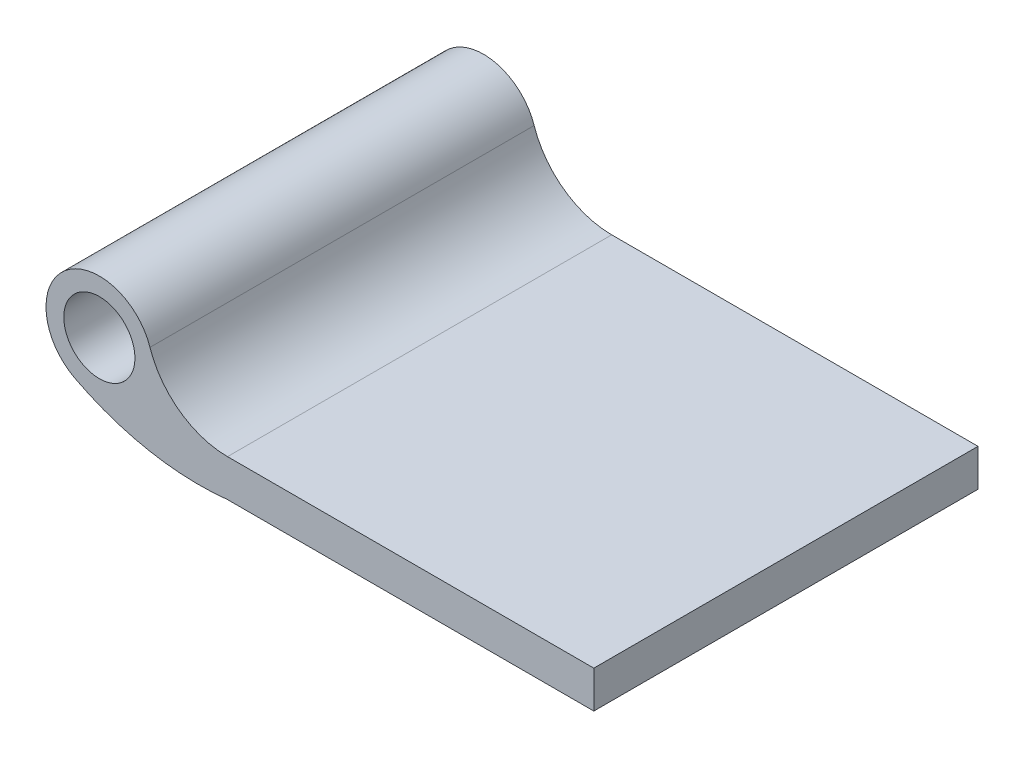
ISO-10303-21;
HEADER;
FILE_DESCRIPTION(('STEP AP214'),'2;1');
FILE_NAME('part.step','',(''),(''),'','','');
FILE_SCHEMA(('AUTOMOTIVE_DESIGN { 1 0 10303 214 1 1 1 1 }'));
ENDSEC;
DATA;
#1=APPLICATION_CONTEXT('core data for automotive mechanical design processes');
#2=APPLICATION_PROTOCOL_DEFINITION('international standard','automotive_design',2000,#1);
#3=PRODUCT_CONTEXT('',#1,'mechanical');
#4=PRODUCT('Part','Part','',(#3));
#5=PRODUCT_RELATED_PRODUCT_CATEGORY('part','',(#4));
#6=PRODUCT_DEFINITION_FORMATION('','',#4);
#7=PRODUCT_DEFINITION_CONTEXT('part definition',#1,'design');
#8=PRODUCT_DEFINITION('design','',#6,#7);
#9=PRODUCT_DEFINITION_SHAPE('','',#8);
#10=(LENGTH_UNIT() NAMED_UNIT(*) SI_UNIT(.MILLI.,.METRE.));
#11=(NAMED_UNIT(*) PLANE_ANGLE_UNIT() SI_UNIT($,.RADIAN.));
#12=(NAMED_UNIT(*) SI_UNIT($,.STERADIAN.) SOLID_ANGLE_UNIT());
#13=UNCERTAINTY_MEASURE_WITH_UNIT(LENGTH_MEASURE(1.E-05),#10,'distance_accuracy_value','');
#14=(GEOMETRIC_REPRESENTATION_CONTEXT(3) GLOBAL_UNCERTAINTY_ASSIGNED_CONTEXT((#13)) GLOBAL_UNIT_ASSIGNED_CONTEXT((#10,
#11,#12)) REPRESENTATION_CONTEXT('',''));
#15=CARTESIAN_POINT('',(0.,0.,0.));
#16=DIRECTION('',(0.,0.,1.));
#17=DIRECTION('',(1.,0.,0.));
#18=AXIS2_PLACEMENT_3D('',#15,#16,#17);
#19=CARTESIAN_POINT('',(36.026336114154,12.0139133910868,108.));
#20=DIRECTION('',(0.,0.,-1.));
#21=DIRECTION('',(-1.,0.,0.));
#22=AXIS2_PLACEMENT_3D('',#19,#20,#21);
#23=CYLINDRICAL_SURFACE('',#22,22.9767166666437);
#24=CARTESIAN_POINT('',(36.026336114154,12.0139133910868,0.));
#25=DIRECTION('',(0.,0.,1.));
#26=DIRECTION('',(1.,0.,0.));
#27=AXIS2_PLACEMENT_3D('',#24,#25,#26);
#28=CIRCLE('',#27,22.9767166666437);
#29=CARTESIAN_POINT('',(14.229640925935,4.74524173451217,0.));
#30=VERTEX_POINT('',#29);
#31=CARTESIAN_POINT('',(36.026336114154,-10.9628032755569,0.));
#32=VERTEX_POINT('',#31);
#33=EDGE_CURVE('E120',#30,#32,#28,.T.);
#34=ORIENTED_EDGE('',*,*,#33,.F.);
#35=DIRECTION('',(0.,0.,-1.));
#36=VECTOR('',#35,1.);
#37=CARTESIAN_POINT('',(14.229640925935,4.74524173451217,108.));
#38=LINE('',#37,#36);
#39=CARTESIAN_POINT('',(14.229640925935,4.74524173451217,108.));
#40=VERTEX_POINT('',#39);
#41=EDGE_CURVE('E11',#40,#30,#38,.T.);
#42=ORIENTED_EDGE('',*,*,#41,.F.);
#43=CARTESIAN_POINT('',(36.026336114154,12.0139133910868,108.));
#44=DIRECTION('',(0.,0.,1.));
#45=DIRECTION('',(1.,0.,0.));
#46=AXIS2_PLACEMENT_3D('',#43,#44,#45);
#47=CIRCLE('',#46,22.9767166666437);
#48=CARTESIAN_POINT('',(36.026336114154,-10.9628032755569,108.));
#49=VERTEX_POINT('',#48);
#50=EDGE_CURVE('E135',#40,#49,#47,.T.);
#51=ORIENTED_EDGE('',*,*,#50,.T.);
#52=DIRECTION('',(0.,0.,-1.));
#53=VECTOR('',#52,1.);
#54=CARTESIAN_POINT('',(36.026336114154,-10.9628032755569,108.));
#55=LINE('',#54,#53);
#56=EDGE_CURVE('E78',#49,#32,#55,.T.);
#57=ORIENTED_EDGE('',*,*,#56,.T.);
#58=EDGE_LOOP('',(#34,#42,#51,#57));
#59=FACE_BOUND('',#58,.T.);
#60=ADVANCED_FACE('F34',(#59),#23,.F.);
#61=CARTESIAN_POINT('',(0.,0.,108.));
#62=DIRECTION('',(0.,0.,-1.));
#63=DIRECTION('',(-1.,0.,0.));
#64=AXIS2_PLACEMENT_3D('',#61,#62,#63);
#65=CYLINDRICAL_SURFACE('',#64,15.);
#66=CARTESIAN_POINT('',(0.,0.,0.));
#67=DIRECTION('',(0.,0.,1.));
#68=DIRECTION('',(1.,0.,0.));
#69=AXIS2_PLACEMENT_3D('',#66,#67,#68);
#70=CIRCLE('',#69,15.);
#71=CARTESIAN_POINT('',(-6.91489474269762,-13.3110567085192,0.));
#72=VERTEX_POINT('',#71);
#73=EDGE_CURVE('E123',#30,#72,#70,.T.);
#74=ORIENTED_EDGE('',*,*,#73,.T.);
#75=DIRECTION('',(0.,0.,-1.));
#76=VECTOR('',#75,1.);
#77=CARTESIAN_POINT('',(-6.91489474269762,-13.3110567085192,108.));
#78=LINE('',#77,#76);
#79=CARTESIAN_POINT('',(-6.91489474269762,-13.3110567085192,108.));
#80=VERTEX_POINT('',#79);
#81=EDGE_CURVE('E42',#80,#72,#78,.T.);
#82=ORIENTED_EDGE('',*,*,#81,.F.);
#83=CARTESIAN_POINT('',(0.,0.,108.));
#84=DIRECTION('',(0.,0.,1.));
#85=DIRECTION('',(1.,0.,0.));
#86=AXIS2_PLACEMENT_3D('',#83,#84,#85);
#87=CIRCLE('',#86,15.);
#88=EDGE_CURVE('E112',#40,#80,#87,.T.);
#89=ORIENTED_EDGE('',*,*,#88,.F.);
#90=ORIENTED_EDGE('',*,*,#41,.T.);
#91=EDGE_LOOP('',(#74,#82,#89,#90));
#92=FACE_BOUND('',#91,.T.);
#93=ADVANCED_FACE('F152',(#92),#65,.T.);
#94=CARTESIAN_POINT('',(28.0230008473586,53.9438078672115,108.));
#95=DIRECTION('',(0.,0.,-1.));
#96=DIRECTION('',(-1.,0.,0.));
#97=AXIS2_PLACEMENT_3D('',#94,#95,#96);
#98=CYLINDRICAL_SURFACE('',#97,75.7883457885283);
#99=CARTESIAN_POINT('',(28.0230008473586,53.9438078672115,0.));
#100=DIRECTION('',(0.,0.,1.));
#101=DIRECTION('',(1.,0.,0.));
#102=AXIS2_PLACEMENT_3D('',#99,#100,#101);
#103=CIRCLE('',#102,75.7883457885283);
#104=CARTESIAN_POINT('',(36.026336114154,-21.4207725533601,0.));
#105=VERTEX_POINT('',#104);
#106=EDGE_CURVE('E125',#72,#105,#103,.T.);
#107=ORIENTED_EDGE('',*,*,#106,.T.);
#108=DIRECTION('',(0.,0.,-1.));
#109=VECTOR('',#108,1.);
#110=CARTESIAN_POINT('',(36.026336114154,-21.4207725533601,108.));
#111=LINE('',#110,#109);
#112=CARTESIAN_POINT('',(36.026336114154,-21.4207725533601,108.));
#113=VERTEX_POINT('',#112);
#114=EDGE_CURVE('E100',#113,#105,#111,.T.);
#115=ORIENTED_EDGE('',*,*,#114,.F.);
#116=CARTESIAN_POINT('',(28.0230008473586,53.9438078672115,108.));
#117=DIRECTION('',(0.,0.,1.));
#118=DIRECTION('',(1.,0.,0.));
#119=AXIS2_PLACEMENT_3D('',#116,#117,#118);
#120=CIRCLE('',#119,75.7883457885283);
#121=EDGE_CURVE('E109',#80,#113,#120,.T.);
#122=ORIENTED_EDGE('',*,*,#121,.F.);
#123=ORIENTED_EDGE('',*,*,#81,.T.);
#124=EDGE_LOOP('',(#107,#115,#122,#123));
#125=FACE_BOUND('',#124,.T.);
#126=ADVANCED_FACE('F142',(#125),#98,.T.);
#127=CARTESIAN_POINT('',(0.,-21.4207725533601,108.));
#128=DIRECTION('',(0.,-1.,0.));
#129=DIRECTION('',(0.,0.,-1.));
#130=AXIS2_PLACEMENT_3D('',#127,#128,#129);
#131=PLANE('',#130);
#132=DIRECTION('',(-1.,0.,0.));
#133=VECTOR('',#132,1.);
#134=CARTESIAN_POINT('',(0.,-21.4207725533601,0.));
#135=LINE('',#134,#133);
#136=CARTESIAN_POINT('',(139.,-21.4207725533601,0.));
#137=VERTEX_POINT('',#136);
#138=EDGE_CURVE('E99',#137,#105,#135,.T.);
#139=ORIENTED_EDGE('',*,*,#138,.F.);
#140=DIRECTION('',(0.,0.,-1.));
#141=VECTOR('',#140,1.);
#142=CARTESIAN_POINT('',(139.,-21.4207725533601,108.));
#143=LINE('',#142,#141);
#144=CARTESIAN_POINT('',(139.,-21.4207725533601,108.));
#145=VERTEX_POINT('',#144);
#146=EDGE_CURVE('E93',#145,#137,#143,.T.);
#147=ORIENTED_EDGE('',*,*,#146,.F.);
#148=DIRECTION('',(-1.,0.,0.));
#149=VECTOR('',#148,1.);
#150=CARTESIAN_POINT('',(0.,-21.4207725533601,108.));
#151=LINE('',#150,#149);
#152=EDGE_CURVE('E97',#145,#113,#151,.T.);
#153=ORIENTED_EDGE('',*,*,#152,.T.);
#154=ORIENTED_EDGE('',*,*,#114,.T.);
#155=EDGE_LOOP('',(#139,#147,#153,#154));
#156=FACE_BOUND('',#155,.T.);
#157=ADVANCED_FACE('F95',(#156),#131,.T.);
#158=CARTESIAN_POINT('',(139.,0.,108.));
#159=DIRECTION('',(-1.,0.,0.));
#160=DIRECTION('',(0.,0.,1.));
#161=AXIS2_PLACEMENT_3D('',#158,#159,#160);
#162=PLANE('',#161);
#163=DIRECTION('',(0.,1.,0.));
#164=VECTOR('',#163,1.);
#165=CARTESIAN_POINT('',(139.,0.,0.));
#166=LINE('',#165,#164);
#167=CARTESIAN_POINT('',(139.,-10.9628032755569,0.));
#168=VERTEX_POINT('',#167);
#169=EDGE_CURVE('E71',#137,#168,#166,.T.);
#170=ORIENTED_EDGE('',*,*,#169,.T.);
#171=DIRECTION('',(0.,0.,-1.));
#172=VECTOR('',#171,1.);
#173=CARTESIAN_POINT('',(139.,-10.9628032755569,108.));
#174=LINE('',#173,#172);
#175=CARTESIAN_POINT('',(139.,-10.9628032755569,108.));
#176=VERTEX_POINT('',#175);
#177=EDGE_CURVE('E101',#176,#168,#174,.T.);
#178=ORIENTED_EDGE('',*,*,#177,.F.);
#179=DIRECTION('',(0.,1.,0.));
#180=VECTOR('',#179,1.);
#181=CARTESIAN_POINT('',(139.,0.,108.));
#182=LINE('',#181,#180);
#183=EDGE_CURVE('E103',#145,#176,#182,.T.);
#184=ORIENTED_EDGE('',*,*,#183,.F.);
#185=ORIENTED_EDGE('',*,*,#146,.T.);
#186=EDGE_LOOP('',(#170,#178,#184,#185));
#187=FACE_BOUND('',#186,.T.);
#188=ADVANCED_FACE('F104',(#187),#162,.F.);
#189=CARTESIAN_POINT('',(0.,-10.9628032755569,108.));
#190=DIRECTION('',(0.,-1.,0.));
#191=DIRECTION('',(1.,0.,0.));
#192=AXIS2_PLACEMENT_3D('',#189,#190,#191);
#193=PLANE('',#192);
#194=DIRECTION('',(-1.,0.,0.));
#195=VECTOR('',#194,1.);
#196=CARTESIAN_POINT('',(0.,-10.9628032755569,0.));
#197=LINE('',#196,#195);
#198=EDGE_CURVE('E130',#168,#32,#197,.T.);
#199=ORIENTED_EDGE('',*,*,#198,.T.);
#200=ORIENTED_EDGE('',*,*,#56,.F.);
#201=DIRECTION('',(-1.,0.,0.));
#202=VECTOR('',#201,1.);
#203=CARTESIAN_POINT('',(0.,-10.9628032755569,108.));
#204=LINE('',#203,#202);
#205=EDGE_CURVE('E50',#176,#49,#204,.T.);
#206=ORIENTED_EDGE('',*,*,#205,.F.);
#207=ORIENTED_EDGE('',*,*,#177,.T.);
#208=EDGE_LOOP('',(#199,#200,#206,#207));
#209=FACE_BOUND('',#208,.T.);
#210=ADVANCED_FACE('F150',(#209),#193,.F.);
#211=CARTESIAN_POINT('',(0.,0.,108.));
#212=DIRECTION('',(0.,0.,-1.));
#213=DIRECTION('',(-1.,0.,0.));
#214=AXIS2_PLACEMENT_3D('',#211,#212,#213);
#215=CYLINDRICAL_SURFACE('',#214,10.);
#216=CARTESIAN_POINT('',(0.,0.,108.));
#217=DIRECTION('',(0.,0.,1.));
#218=DIRECTION('',(1.,0.,0.));
#219=AXIS2_PLACEMENT_3D('',#216,#217,#218);
#220=CIRCLE('',#219,10.);
#221=CARTESIAN_POINT('',(10.,0.,108.));
#222=VERTEX_POINT('',#221);
#223=EDGE_CURVE('E117',#222,#222,#220,.T.);
#224=ORIENTED_EDGE('',*,*,#223,.T.);
#225=EDGE_LOOP('',(#224));
#226=FACE_BOUND('',#225,.T.);
#227=CARTESIAN_POINT('',(0.,0.,0.));
#228=DIRECTION('',(0.,0.,1.));
#229=DIRECTION('',(1.,0.,0.));
#230=AXIS2_PLACEMENT_3D('',#227,#228,#229);
#231=CIRCLE('',#230,10.);
#232=CARTESIAN_POINT('',(10.,0.,0.));
#233=VERTEX_POINT('',#232);
#234=EDGE_CURVE('E132',#233,#233,#231,.T.);
#235=ORIENTED_EDGE('',*,*,#234,.F.);
#236=EDGE_LOOP('',(#235));
#237=FACE_BOUND('',#236,.T.);
#238=ADVANCED_FACE('F166',(#226,#237),#215,.F.);
#239=CARTESIAN_POINT('',(0.,0.,108.));
#240=DIRECTION('',(0.,0.,1.));
#241=DIRECTION('',(1.,0.,0.));
#242=AXIS2_PLACEMENT_3D('',#239,#240,#241);
#243=PLANE('',#242);
#244=ORIENTED_EDGE('',*,*,#50,.F.);
#245=ORIENTED_EDGE('',*,*,#88,.T.);
#246=ORIENTED_EDGE('',*,*,#121,.T.);
#247=ORIENTED_EDGE('',*,*,#152,.F.);
#248=ORIENTED_EDGE('',*,*,#183,.T.);
#249=ORIENTED_EDGE('',*,*,#205,.T.);
#250=EDGE_LOOP('',(#244,#245,#246,#247,#248,#249));
#251=FACE_BOUND('',#250,.T.);
#252=ORIENTED_EDGE('',*,*,#223,.F.);
#253=EDGE_LOOP('',(#252));
#254=FACE_BOUND('',#253,.T.);
#255=ADVANCED_FACE('F106',(#251,#254),#243,.T.);
#256=CARTESIAN_POINT('',(0.,0.,0.));
#257=DIRECTION('',(0.,0.,1.));
#258=DIRECTION('',(1.,0.,0.));
#259=AXIS2_PLACEMENT_3D('',#256,#257,#258);
#260=PLANE('',#259);
#261=ORIENTED_EDGE('',*,*,#33,.T.);
#262=ORIENTED_EDGE('',*,*,#198,.F.);
#263=ORIENTED_EDGE('',*,*,#169,.F.);
#264=ORIENTED_EDGE('',*,*,#138,.T.);
#265=ORIENTED_EDGE('',*,*,#106,.F.);
#266=ORIENTED_EDGE('',*,*,#73,.F.);
#267=EDGE_LOOP('',(#261,#262,#263,#264,#265,#266));
#268=FACE_BOUND('',#267,.T.);
#269=ORIENTED_EDGE('',*,*,#234,.T.);
#270=EDGE_LOOP('',(#269));
#271=FACE_BOUND('',#270,.T.);
#272=ADVANCED_FACE('F146',(#268,#271),#260,.F.);
#273=CLOSED_SHELL('',(#60,#93,#126,#157,#188,#210,#238,#255,#272));
#274=MANIFOLD_SOLID_BREP('B2',#273);
#275=ADVANCED_BREP_SHAPE_REPRESENTATION('',(#18,#274),#14);
#276=SHAPE_DEFINITION_REPRESENTATION(#9,#275);
ENDSEC;
END-ISO-10303-21;
